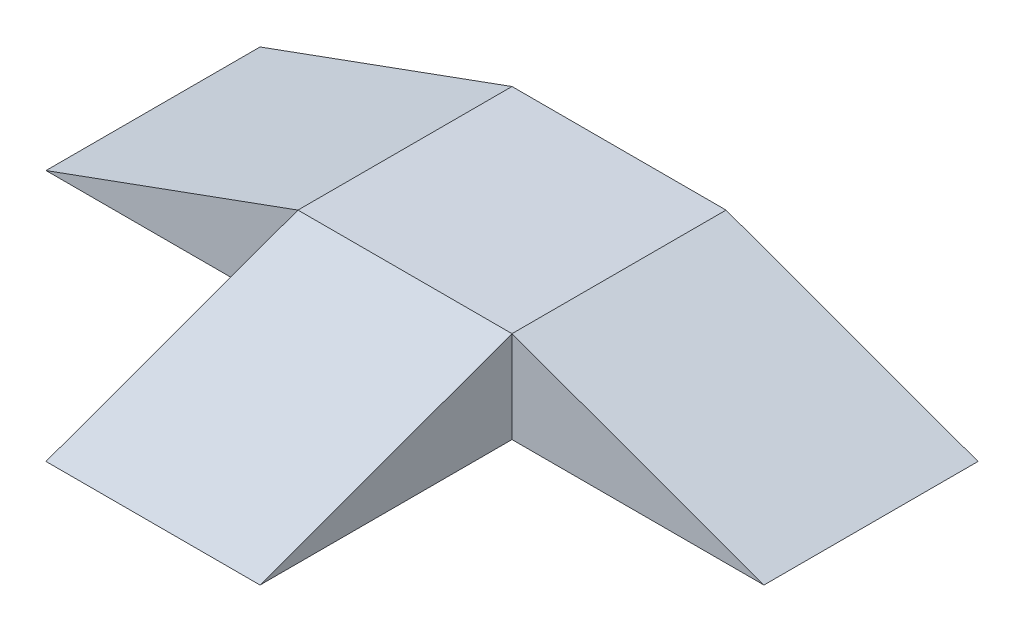
ISO-10303-21;
HEADER;
FILE_DESCRIPTION(('STEP AP214'),'2;1');
FILE_NAME('part.step','',(''),(''),'','','');
FILE_SCHEMA(('AUTOMOTIVE_DESIGN { 1 0 10303 214 1 1 1 1 }'));
ENDSEC;
DATA;
#1=APPLICATION_CONTEXT('core data for automotive mechanical design processes');
#2=APPLICATION_PROTOCOL_DEFINITION('international standard','automotive_design',2000,#1);
#3=PRODUCT_CONTEXT('',#1,'mechanical');
#4=PRODUCT('Part','Part','',(#3));
#5=PRODUCT_RELATED_PRODUCT_CATEGORY('part','',(#4));
#6=PRODUCT_DEFINITION_FORMATION('','',#4);
#7=PRODUCT_DEFINITION_CONTEXT('part definition',#1,'design');
#8=PRODUCT_DEFINITION('design','',#6,#7);
#9=PRODUCT_DEFINITION_SHAPE('','',#8);
#10=(LENGTH_UNIT() NAMED_UNIT(*) SI_UNIT(.MILLI.,.METRE.));
#11=(NAMED_UNIT(*) PLANE_ANGLE_UNIT() SI_UNIT($,.RADIAN.));
#12=(NAMED_UNIT(*) SI_UNIT($,.STERADIAN.) SOLID_ANGLE_UNIT());
#13=UNCERTAINTY_MEASURE_WITH_UNIT(LENGTH_MEASURE(1.E-05),#10,'distance_accuracy_value','');
#14=(GEOMETRIC_REPRESENTATION_CONTEXT(3) GLOBAL_UNCERTAINTY_ASSIGNED_CONTEXT((#13)) GLOBAL_UNIT_ASSIGNED_CONTEXT((#10,
#11,#12)) REPRESENTATION_CONTEXT('',''));
#15=CARTESIAN_POINT('',(0.,0.,0.));
#16=DIRECTION('',(0.,0.,1.));
#17=DIRECTION('',(1.,0.,0.));
#18=AXIS2_PLACEMENT_3D('',#15,#16,#17);
#19=CARTESIAN_POINT('',(1750.,1500.,0.));
#20=DIRECTION('',(-1.,0.,0.));
#21=DIRECTION('',(0.,0.,1.));
#22=AXIS2_PLACEMENT_3D('',#19,#20,#21);
#23=PLANE('',#22);
#24=DIRECTION('',(0.,-1.,0.));
#25=VECTOR('',#24,1.);
#26=CARTESIAN_POINT('',(1750.,1500.,1750.));
#27=LINE('',#26,#25);
#28=CARTESIAN_POINT('',(1750.,1500.,1750.));
#29=VERTEX_POINT('',#28);
#30=CARTESIAN_POINT('',(1750.,0.,1750.));
#31=VERTEX_POINT('',#30);
#32=EDGE_CURVE('E110',#29,#31,#27,.T.);
#33=ORIENTED_EDGE('',*,*,#32,.F.);
#34=DIRECTION('',(0.,0.342109285519093,-0.939660170892443));
#35=VECTOR('',#34,1.);
#36=CARTESIAN_POINT('',(1750.,1500.,1750.));
#37=LINE('',#36,#35);
#38=CARTESIAN_POINT('',(1750.,0.,5870.));
#39=VERTEX_POINT('',#38);
#40=EDGE_CURVE('E123',#39,#29,#37,.T.);
#41=ORIENTED_EDGE('',*,*,#40,.F.);
#42=DIRECTION('',(0.,0.,-1.));
#43=VECTOR('',#42,1.);
#44=CARTESIAN_POINT('',(1750.,0.,0.));
#45=LINE('',#44,#43);
#46=EDGE_CURVE('E159',#39,#31,#45,.T.);
#47=ORIENTED_EDGE('',*,*,#46,.T.);
#48=EDGE_LOOP('',(#33,#41,#47));
#49=FACE_BOUND('',#48,.T.);
#50=ADVANCED_FACE('F33',(#49),#23,.F.);
#51=CARTESIAN_POINT('',(-1750.,1500.,0.));
#52=DIRECTION('',(-1.,0.,0.));
#53=DIRECTION('',(0.,0.,1.));
#54=AXIS2_PLACEMENT_3D('',#51,#52,#53);
#55=PLANE('',#54);
#56=DIRECTION('',(0.,-0.342109285519093,0.939660170892443));
#57=VECTOR('',#56,1.);
#58=CARTESIAN_POINT('',(-1750.,2062.56632196583,204.817835667173));
#59=LINE('',#58,#57);
#60=CARTESIAN_POINT('',(-1750.,1500.,1750.));
#61=VERTEX_POINT('',#60);
#62=CARTESIAN_POINT('',(-1750.,0.,5870.));
#63=VERTEX_POINT('',#62);
#64=EDGE_CURVE('E58',#61,#63,#59,.T.);
#65=ORIENTED_EDGE('',*,*,#64,.F.);
#66=DIRECTION('',(0.,-1.,0.));
#67=VECTOR('',#66,1.);
#68=CARTESIAN_POINT('',(-1750.,1500.,1750.));
#69=LINE('',#68,#67);
#70=CARTESIAN_POINT('',(-1750.,0.,1750.));
#71=VERTEX_POINT('',#70);
#72=EDGE_CURVE('E115',#61,#71,#69,.T.);
#73=ORIENTED_EDGE('',*,*,#72,.T.);
#74=DIRECTION('',(0.,0.,-1.));
#75=VECTOR('',#74,1.);
#76=CARTESIAN_POINT('',(-1750.,0.,0.));
#77=LINE('',#76,#75);
#78=EDGE_CURVE('E154',#63,#71,#77,.T.);
#79=ORIENTED_EDGE('',*,*,#78,.F.);
#80=EDGE_LOOP('',(#65,#73,#79));
#81=FACE_BOUND('',#80,.T.);
#82=ADVANCED_FACE('F35',(#81),#55,.T.);
#83=CARTESIAN_POINT('',(0.,1500.,-1750.));
#84=DIRECTION('',(0.,0.,1.));
#85=DIRECTION('',(1.,0.,0.));
#86=AXIS2_PLACEMENT_3D('',#83,#84,#85);
#87=PLANE('',#86);
#88=DIRECTION('',(-1.,0.,0.));
#89=VECTOR('',#88,1.);
#90=CARTESIAN_POINT('',(0.,1500.,-1750.));
#91=LINE('',#90,#89);
#92=CARTESIAN_POINT('',(1750.,1500.,-1750.));
#93=VERTEX_POINT('',#92);
#94=CARTESIAN_POINT('',(-1750.,1500.,-1750.0000025));
#95=VERTEX_POINT('',#94);
#96=EDGE_CURVE('E11',#93,#95,#91,.T.);
#97=ORIENTED_EDGE('',*,*,#96,.F.);
#98=DIRECTION('',(0.939660170892443,-0.342109285519093,0.));
#99=VECTOR('',#98,1.);
#100=CARTESIAN_POINT('',(204.817835667173,2062.56632196584,-1750.));
#101=LINE('',#100,#99);
#102=CARTESIAN_POINT('',(5870.,0.,-1750.));
#103=VERTEX_POINT('',#102);
#104=EDGE_CURVE('E167',#93,#103,#101,.T.);
#105=ORIENTED_EDGE('',*,*,#104,.T.);
#106=DIRECTION('',(-1.,0.,0.));
#107=VECTOR('',#106,1.);
#108=CARTESIAN_POINT('',(0.,0.,-1750.));
#109=LINE('',#108,#107);
#110=CARTESIAN_POINT('',(-5870.,0.,-1750.));
#111=VERTEX_POINT('',#110);
#112=EDGE_CURVE('E42',#103,#111,#109,.T.);
#113=ORIENTED_EDGE('',*,*,#112,.T.);
#114=DIRECTION('',(0.939660170892443,0.342109285519093,0.));
#115=VECTOR('',#114,1.);
#116=CARTESIAN_POINT('',(-204.817835667173,2062.56632196583,-1750.));
#117=LINE('',#116,#115);
#118=EDGE_CURVE('E126',#111,#95,#117,.T.);
#119=ORIENTED_EDGE('',*,*,#118,.T.);
#120=EDGE_LOOP('',(#97,#105,#113,#119));
#121=FACE_BOUND('',#120,.T.);
#122=ADVANCED_FACE('F166',(#121),#87,.F.);
#123=CARTESIAN_POINT('',(0.,1500.,0.));
#124=DIRECTION('',(0.,1.,0.));
#125=DIRECTION('',(0.,0.,1.));
#126=AXIS2_PLACEMENT_3D('',#123,#124,#125);
#127=PLANE('',#126);
#128=DIRECTION('',(0.,0.,1.));
#129=VECTOR('',#128,1.);
#130=CARTESIAN_POINT('',(1750.,1500.,-1750.00014));
#131=LINE('',#130,#129);
#132=EDGE_CURVE('E95',#93,#29,#131,.T.);
#133=ORIENTED_EDGE('',*,*,#132,.F.);
#134=ORIENTED_EDGE('',*,*,#96,.T.);
#135=DIRECTION('',(0.,0.,1.));
#136=VECTOR('',#135,1.);
#137=CARTESIAN_POINT('',(-1750.,1500.,-1750.000025));
#138=LINE('',#137,#136);
#139=EDGE_CURVE('E137',#95,#61,#138,.T.);
#140=ORIENTED_EDGE('',*,*,#139,.T.);
#141=DIRECTION('',(1.,0.,0.));
#142=VECTOR('',#141,1.);
#143=CARTESIAN_POINT('',(-5870.000025,1500.,1750.));
#144=LINE('',#143,#142);
#145=EDGE_CURVE('E125',#61,#29,#144,.T.);
#146=ORIENTED_EDGE('',*,*,#145,.T.);
#147=EDGE_LOOP('',(#133,#134,#140,#146));
#148=FACE_BOUND('',#147,.T.);
#149=ADVANCED_FACE('F179',(#148),#127,.T.);
#150=CARTESIAN_POINT('',(0.,0.,0.));
#151=DIRECTION('',(0.,1.,0.));
#152=DIRECTION('',(0.,0.,1.));
#153=AXIS2_PLACEMENT_3D('',#150,#151,#152);
#154=PLANE('',#153);
#155=ORIENTED_EDGE('',*,*,#78,.T.);
#156=DIRECTION('',(1.,0.,0.));
#157=VECTOR('',#156,1.);
#158=CARTESIAN_POINT('',(0.,0.,1750.));
#159=LINE('',#158,#157);
#160=CARTESIAN_POINT('',(-5870.,0.,1750.));
#161=VERTEX_POINT('',#160);
#162=EDGE_CURVE('E50',#161,#71,#159,.T.);
#163=ORIENTED_EDGE('',*,*,#162,.F.);
#164=DIRECTION('',(0.,0.,-1.));
#165=VECTOR('',#164,1.);
#166=CARTESIAN_POINT('',(-5870.,0.,0.));
#167=LINE('',#166,#165);
#168=EDGE_CURVE('E150',#161,#111,#167,.T.);
#169=ORIENTED_EDGE('',*,*,#168,.T.);
#170=ORIENTED_EDGE('',*,*,#112,.F.);
#171=DIRECTION('',(0.,0.,-1.));
#172=VECTOR('',#171,1.);
#173=CARTESIAN_POINT('',(5870.,0.,0.));
#174=LINE('',#173,#172);
#175=CARTESIAN_POINT('',(5870.,0.,1750.));
#176=VERTEX_POINT('',#175);
#177=EDGE_CURVE('E92',#176,#103,#174,.T.);
#178=ORIENTED_EDGE('',*,*,#177,.F.);
#179=DIRECTION('',(-1.,0.,0.));
#180=VECTOR('',#179,1.);
#181=CARTESIAN_POINT('',(3.77260251086218E-13,0.,1750.));
#182=LINE('',#181,#180);
#183=EDGE_CURVE('E107',#176,#31,#182,.T.);
#184=ORIENTED_EDGE('',*,*,#183,.T.);
#185=ORIENTED_EDGE('',*,*,#46,.F.);
#186=DIRECTION('',(-1.,0.,0.));
#187=VECTOR('',#186,1.);
#188=CARTESIAN_POINT('',(0.,0.,5870.));
#189=LINE('',#188,#187);
#190=EDGE_CURVE('E169',#39,#63,#189,.T.);
#191=ORIENTED_EDGE('',*,*,#190,.T.);
#192=EDGE_LOOP('',(#155,#163,#169,#170,#178,#184,#185,#191));
#193=FACE_BOUND('',#192,.T.);
#194=ADVANCED_FACE('F105',(#193),#154,.F.);
#195=CARTESIAN_POINT('',(0.,1500.,1750.));
#196=DIRECTION('',(0.,0.,-1.));
#197=DIRECTION('',(-1.,0.,0.));
#198=AXIS2_PLACEMENT_3D('',#195,#196,#197);
#199=PLANE('',#198);
#200=ORIENTED_EDGE('',*,*,#72,.F.);
#201=DIRECTION('',(0.939660170892443,0.342109285519093,0.));
#202=VECTOR('',#201,1.);
#203=CARTESIAN_POINT('',(-5870.,0.,1750.));
#204=LINE('',#203,#202);
#205=EDGE_CURVE('E131',#161,#61,#204,.T.);
#206=ORIENTED_EDGE('',*,*,#205,.F.);
#207=ORIENTED_EDGE('',*,*,#162,.T.);
#208=EDGE_LOOP('',(#200,#206,#207));
#209=FACE_BOUND('',#208,.T.);
#210=ADVANCED_FACE('F183',(#209),#199,.F.);
#211=CARTESIAN_POINT('',(3.77260251086218E-13,1500.,1750.));
#212=DIRECTION('',(0.,0.,1.));
#213=DIRECTION('',(1.,0.,0.));
#214=AXIS2_PLACEMENT_3D('',#211,#212,#213);
#215=PLANE('',#214);
#216=DIRECTION('',(0.939660170892443,-0.342109285519093,0.));
#217=VECTOR('',#216,1.);
#218=CARTESIAN_POINT('',(1750.,1500.,1750.));
#219=LINE('',#218,#217);
#220=EDGE_CURVE('E89',#29,#176,#219,.T.);
#221=ORIENTED_EDGE('',*,*,#220,.F.);
#222=ORIENTED_EDGE('',*,*,#32,.T.);
#223=ORIENTED_EDGE('',*,*,#183,.F.);
#224=EDGE_LOOP('',(#221,#222,#223));
#225=FACE_BOUND('',#224,.T.);
#226=ADVANCED_FACE('F112',(#225),#215,.T.);
#227=CARTESIAN_POINT('',(-5870.000025,1500.,1750.));
#228=DIRECTION('',(0.,-0.939660170892443,-0.342109285519093));
#229=DIRECTION('',(0.,0.342109285519093,-0.939660170892443));
#230=AXIS2_PLACEMENT_3D('',#227,#228,#229);
#231=PLANE('',#230);
#232=ORIENTED_EDGE('',*,*,#64,.T.);
#233=ORIENTED_EDGE('',*,*,#190,.F.);
#234=ORIENTED_EDGE('',*,*,#40,.T.);
#235=ORIENTED_EDGE('',*,*,#145,.F.);
#236=EDGE_LOOP('',(#232,#233,#234,#235));
#237=FACE_BOUND('',#236,.T.);
#238=ADVANCED_FACE('F180',(#237),#231,.F.);
#239=CARTESIAN_POINT('',(-5870.,0.,-1750.000025));
#240=DIRECTION('',(0.342109285519093,-0.939660170892443,0.));
#241=DIRECTION('',(0.939660170892443,0.342109285519093,0.));
#242=AXIS2_PLACEMENT_3D('',#239,#240,#241);
#243=PLANE('',#242);
#244=ORIENTED_EDGE('',*,*,#168,.F.);
#245=ORIENTED_EDGE('',*,*,#205,.T.);
#246=ORIENTED_EDGE('',*,*,#139,.F.);
#247=ORIENTED_EDGE('',*,*,#118,.F.);
#248=EDGE_LOOP('',(#244,#245,#246,#247));
#249=FACE_BOUND('',#248,.T.);
#250=ADVANCED_FACE('F184',(#249),#243,.F.);
#251=CARTESIAN_POINT('',(1750.,1500.,-1750.00014));
#252=DIRECTION('',(-0.342109285519093,-0.939660170892443,0.));
#253=DIRECTION('',(0.939660170892443,-0.342109285519093,0.));
#254=AXIS2_PLACEMENT_3D('',#251,#252,#253);
#255=PLANE('',#254);
#256=ORIENTED_EDGE('',*,*,#132,.T.);
#257=ORIENTED_EDGE('',*,*,#220,.T.);
#258=ORIENTED_EDGE('',*,*,#177,.T.);
#259=ORIENTED_EDGE('',*,*,#104,.F.);
#260=EDGE_LOOP('',(#256,#257,#258,#259));
#261=FACE_BOUND('',#260,.T.);
#262=ADVANCED_FACE('F91',(#261),#255,.F.);
#263=CLOSED_SHELL('',(#50,#82,#122,#149,#194,#210,#226,#238,#250,#262));
#264=MANIFOLD_SOLID_BREP('B2',#263);
#265=ADVANCED_BREP_SHAPE_REPRESENTATION('',(#18,#264),#14);
#266=SHAPE_DEFINITION_REPRESENTATION(#9,#265);
ENDSEC;
END-ISO-10303-21;
